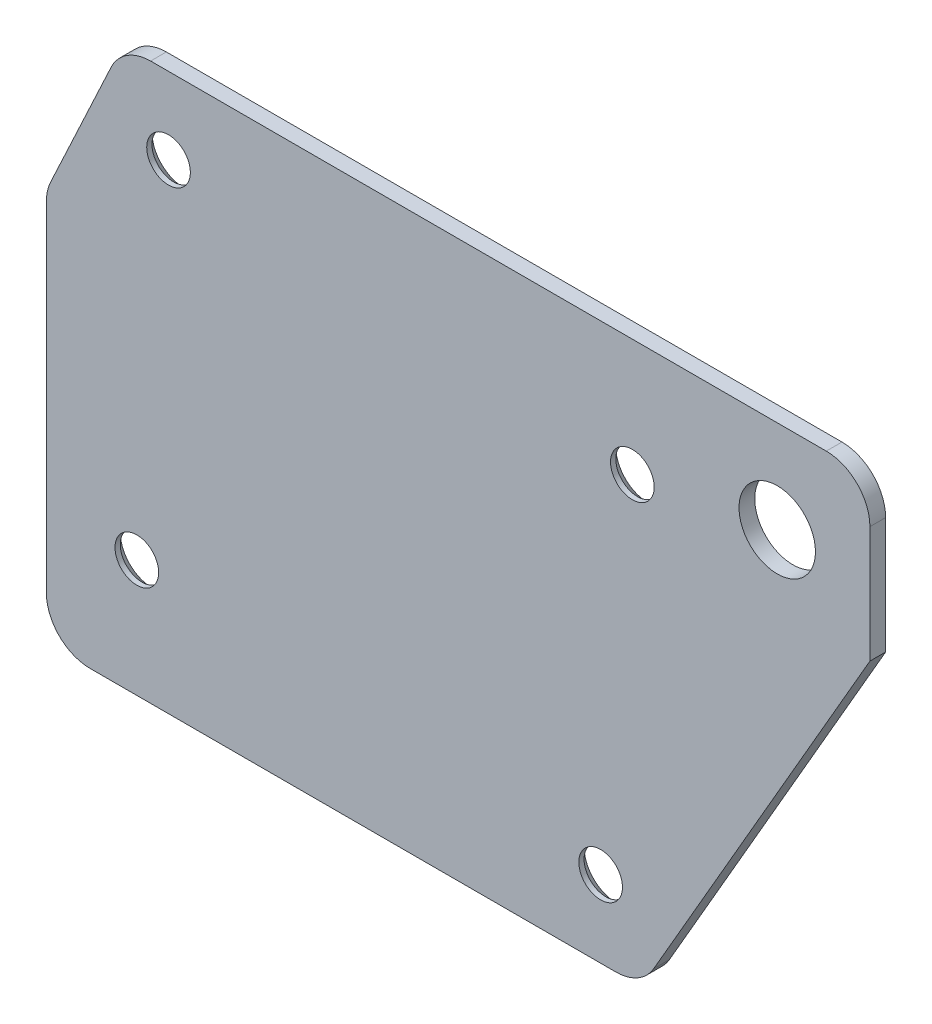
ISO-10303-21;
HEADER;
FILE_DESCRIPTION(('STEP AP214'),'2;1');
FILE_NAME('part.step','',(''),(''),'','','');
FILE_SCHEMA(('AUTOMOTIVE_DESIGN { 1 0 10303 214 1 1 1 1 }'));
ENDSEC;
DATA;
#1=APPLICATION_CONTEXT('core data for automotive mechanical design processes');
#2=APPLICATION_PROTOCOL_DEFINITION('international standard','automotive_design',2000,#1);
#3=PRODUCT_CONTEXT('',#1,'mechanical');
#4=PRODUCT('Part','Part','',(#3));
#5=PRODUCT_RELATED_PRODUCT_CATEGORY('part','',(#4));
#6=PRODUCT_DEFINITION_FORMATION('','',#4);
#7=PRODUCT_DEFINITION_CONTEXT('part definition',#1,'design');
#8=PRODUCT_DEFINITION('design','',#6,#7);
#9=PRODUCT_DEFINITION_SHAPE('','',#8);
#10=(LENGTH_UNIT() NAMED_UNIT(*) SI_UNIT(.MILLI.,.METRE.));
#11=(NAMED_UNIT(*) PLANE_ANGLE_UNIT() SI_UNIT($,.RADIAN.));
#12=(NAMED_UNIT(*) SI_UNIT($,.STERADIAN.) SOLID_ANGLE_UNIT());
#13=UNCERTAINTY_MEASURE_WITH_UNIT(LENGTH_MEASURE(1.E-05),#10,'distance_accuracy_value','');
#14=(GEOMETRIC_REPRESENTATION_CONTEXT(3) GLOBAL_UNCERTAINTY_ASSIGNED_CONTEXT((#13)) GLOBAL_UNIT_ASSIGNED_CONTEXT((#10,
#11,#12)) REPRESENTATION_CONTEXT('',''));
#15=CARTESIAN_POINT('',(0.,0.,0.));
#16=DIRECTION('',(0.,0.,1.));
#17=DIRECTION('',(1.,0.,0.));
#18=AXIS2_PLACEMENT_3D('',#15,#16,#17);
#19=CARTESIAN_POINT('',(37.33799457265,-40.4876,-2.286));
#20=DIRECTION('',(0.866025403784436,-0.500000000000004,0.));
#21=DIRECTION('',(0.500000000000004,0.866025403784436,0.));
#22=AXIS2_PLACEMENT_3D('',#19,#20,#21);
#23=PLANE('',#22);
#24=DIRECTION('',(0.500000000000004,0.866025403784436,0.));
#25=VECTOR('',#24,1.);
#26=CARTESIAN_POINT('',(37.33799457265,-40.4876,0.));
#27=LINE('',#26,#25);
#28=CARTESIAN_POINT('',(39.171081677327,-37.3126,0.));
#29=VERTEX_POINT('',#28);
#30=CARTESIAN_POINT('',(70.6374,17.1886620620045,0.));
#31=VERTEX_POINT('',#30);
#32=EDGE_CURVE('E167',#29,#31,#27,.T.);
#33=ORIENTED_EDGE('',*,*,#32,.F.);
#34=DIRECTION('',(0.,0.,1.));
#35=VECTOR('',#34,1.);
#36=CARTESIAN_POINT('',(39.171081677327,-37.3126,-2.286));
#37=LINE('',#36,#35);
#38=CARTESIAN_POINT('',(39.171081677327,-37.3126,-2.286));
#39=VERTEX_POINT('',#38);
#40=EDGE_CURVE('E55',#29,#39,#37,.F.);
#41=ORIENTED_EDGE('',*,*,#40,.T.);
#42=DIRECTION('',(0.500000000000004,0.866025403784436,0.));
#43=VECTOR('',#42,1.);
#44=CARTESIAN_POINT('',(37.33799457265,-40.4876,-2.286));
#45=LINE('',#44,#43);
#46=CARTESIAN_POINT('',(70.6374,17.1886620620045,-2.286));
#47=VERTEX_POINT('',#46);
#48=EDGE_CURVE('E130',#39,#47,#45,.T.);
#49=ORIENTED_EDGE('',*,*,#48,.T.);
#50=DIRECTION('',(0.,0.,1.));
#51=VECTOR('',#50,1.);
#52=CARTESIAN_POINT('',(70.6374,17.1886620620045,-2.286));
#53=LINE('',#52,#51);
#54=EDGE_CURVE('E132',#47,#31,#53,.T.);
#55=ORIENTED_EDGE('',*,*,#54,.T.);
#56=EDGE_LOOP('',(#33,#41,#49,#55));
#57=FACE_BOUND('',#56,.T.);
#58=ADVANCED_FACE('F47',(#57),#23,.T.);
#59=CARTESIAN_POINT('',(-49.2252,-40.4876,-2.286));
#60=DIRECTION('',(0.,-1.,0.));
#61=DIRECTION('',(0.,0.,-1.));
#62=AXIS2_PLACEMENT_3D('',#59,#60,#61);
#63=PLANE('',#62);
#64=DIRECTION('',(1.,0.,0.));
#65=VECTOR('',#64,1.);
#66=CARTESIAN_POINT('',(-49.2252,-40.4876,-2.286));
#67=LINE('',#66,#65);
#68=CARTESIAN_POINT('',(-42.8752,-40.4876,-2.286));
#69=VERTEX_POINT('',#68);
#70=CARTESIAN_POINT('',(33.6718203632959,-40.4876,-2.286));
#71=VERTEX_POINT('',#70);
#72=EDGE_CURVE('E147',#69,#71,#67,.T.);
#73=ORIENTED_EDGE('',*,*,#72,.T.);
#74=DIRECTION('',(0.,0.,1.));
#75=VECTOR('',#74,1.);
#76=CARTESIAN_POINT('',(33.6718203632959,-40.4876,-2.286));
#77=LINE('',#76,#75);
#78=CARTESIAN_POINT('',(33.6718203632959,-40.4876,0.));
#79=VERTEX_POINT('',#78);
#80=EDGE_CURVE('E325',#71,#79,#77,.T.);
#81=ORIENTED_EDGE('',*,*,#80,.T.);
#82=DIRECTION('',(1.,0.,0.));
#83=VECTOR('',#82,1.);
#84=CARTESIAN_POINT('',(-49.2252,-40.4876,0.));
#85=LINE('',#84,#83);
#86=CARTESIAN_POINT('',(-42.8752,-40.4876,0.));
#87=VERTEX_POINT('',#86);
#88=EDGE_CURVE('E139',#87,#79,#85,.T.);
#89=ORIENTED_EDGE('',*,*,#88,.F.);
#90=DIRECTION('',(0.,0.,1.));
#91=VECTOR('',#90,1.);
#92=CARTESIAN_POINT('',(-42.8752,-40.4876,-2.286));
#93=LINE('',#92,#91);
#94=EDGE_CURVE('E291',#87,#69,#93,.F.);
#95=ORIENTED_EDGE('',*,*,#94,.T.);
#96=EDGE_LOOP('',(#73,#81,#89,#95));
#97=FACE_BOUND('',#96,.T.);
#98=ADVANCED_FACE('F258',(#97),#63,.T.);
#99=CARTESIAN_POINT('',(-49.2252,40.4876,-2.286));
#100=DIRECTION('',(-1.,0.,0.));
#101=DIRECTION('',(0.,-1.,0.));
#102=AXIS2_PLACEMENT_3D('',#99,#100,#101);
#103=PLANE('',#102);
#104=DIRECTION('',(0.,-1.,0.));
#105=VECTOR('',#104,1.);
#106=CARTESIAN_POINT('',(-49.2252,40.4876,0.));
#107=LINE('',#106,#105);
#108=CARTESIAN_POINT('',(-49.2252,15.2217705001645,0.));
#109=VERTEX_POINT('',#108);
#110=CARTESIAN_POINT('',(-49.2252,-34.1376,0.));
#111=VERTEX_POINT('',#110);
#112=EDGE_CURVE('E332',#109,#111,#107,.T.);
#113=ORIENTED_EDGE('',*,*,#112,.F.);
#114=DIRECTION('',(0.,0.,1.));
#115=VECTOR('',#114,1.);
#116=CARTESIAN_POINT('',(-49.2252,15.2217705001645,-2.286));
#117=LINE('',#116,#115);
#118=CARTESIAN_POINT('',(-49.2252,15.2217705001645,-2.286));
#119=VERTEX_POINT('',#118);
#120=EDGE_CURVE('E322',#109,#119,#117,.F.);
#121=ORIENTED_EDGE('',*,*,#120,.T.);
#122=DIRECTION('',(0.,-1.,0.));
#123=VECTOR('',#122,1.);
#124=CARTESIAN_POINT('',(-49.2252,40.4876,-2.286));
#125=LINE('',#124,#123);
#126=CARTESIAN_POINT('',(-49.2252,-34.1376,-2.286));
#127=VERTEX_POINT('',#126);
#128=EDGE_CURVE('E157',#119,#127,#125,.T.);
#129=ORIENTED_EDGE('',*,*,#128,.T.);
#130=DIRECTION('',(0.,0.,1.));
#131=VECTOR('',#130,1.);
#132=CARTESIAN_POINT('',(-49.2252,-34.1376,-2.286));
#133=LINE('',#132,#131);
#134=EDGE_CURVE('E293',#127,#111,#133,.T.);
#135=ORIENTED_EDGE('',*,*,#134,.T.);
#136=EDGE_LOOP('',(#113,#121,#129,#135));
#137=FACE_BOUND('',#136,.T.);
#138=ADVANCED_FACE('F263',(#137),#103,.T.);
#139=CARTESIAN_POINT('',(70.6374,40.4876,-2.286));
#140=DIRECTION('',(0.,1.,0.));
#141=DIRECTION('',(-1.,0.,0.));
#142=AXIS2_PLACEMENT_3D('',#139,#140,#141);
#143=PLANE('',#142);
#144=DIRECTION('',(-1.,0.,0.));
#145=VECTOR('',#144,1.);
#146=CARTESIAN_POINT('',(70.6374,40.4876,-2.286));
#147=LINE('',#146,#145);
#148=CARTESIAN_POINT('',(64.2874,40.4876,-2.286));
#149=VERTEX_POINT('',#148);
#150=CARTESIAN_POINT('',(-34.0546038438724,40.4876,-2.286));
#151=VERTEX_POINT('',#150);
#152=EDGE_CURVE('E154',#149,#151,#147,.T.);
#153=ORIENTED_EDGE('',*,*,#152,.T.);
#154=DIRECTION('',(0.,0.,-1.));
#155=VECTOR('',#154,1.);
#156=CARTESIAN_POINT('',(-34.0546038438724,40.4876,0.));
#157=LINE('',#156,#155);
#158=CARTESIAN_POINT('',(-34.0546038438724,40.4876,0.));
#159=VERTEX_POINT('',#158);
#160=EDGE_CURVE('E311',#151,#159,#157,.F.);
#161=ORIENTED_EDGE('',*,*,#160,.T.);
#162=DIRECTION('',(-1.,0.,0.));
#163=VECTOR('',#162,1.);
#164=CARTESIAN_POINT('',(70.6374,40.4876,0.));
#165=LINE('',#164,#163);
#166=CARTESIAN_POINT('',(64.2874,40.4876,0.));
#167=VERTEX_POINT('',#166);
#168=EDGE_CURVE('E335',#167,#159,#165,.T.);
#169=ORIENTED_EDGE('',*,*,#168,.F.);
#170=DIRECTION('',(0.,0.,1.));
#171=VECTOR('',#170,1.);
#172=CARTESIAN_POINT('',(64.2874,40.4876,-2.286));
#173=LINE('',#172,#171);
#174=EDGE_CURVE('E309',#167,#149,#173,.F.);
#175=ORIENTED_EDGE('',*,*,#174,.T.);
#176=EDGE_LOOP('',(#153,#161,#169,#175));
#177=FACE_BOUND('',#176,.T.);
#178=ADVANCED_FACE('F415',(#177),#143,.T.);
#179=CARTESIAN_POINT('',(70.6374,40.4876,-2.286));
#180=DIRECTION('',(1.,0.,0.));
#181=DIRECTION('',(0.,0.,-1.));
#182=AXIS2_PLACEMENT_3D('',#179,#180,#181);
#183=PLANE('',#182);
#184=DIRECTION('',(0.,1.,0.));
#185=VECTOR('',#184,1.);
#186=CARTESIAN_POINT('',(70.6374,40.4876,-2.286));
#187=LINE('',#186,#185);
#188=CARTESIAN_POINT('',(70.6374,34.1376,-2.286));
#189=VERTEX_POINT('',#188);
#190=EDGE_CURVE('E138',#47,#189,#187,.T.);
#191=ORIENTED_EDGE('',*,*,#190,.T.);
#192=DIRECTION('',(0.,0.,1.));
#193=VECTOR('',#192,1.);
#194=CARTESIAN_POINT('',(70.6374,34.1376,-2.286));
#195=LINE('',#194,#193);
#196=CARTESIAN_POINT('',(70.6374,34.1376,0.));
#197=VERTEX_POINT('',#196);
#198=EDGE_CURVE('E13',#189,#197,#195,.T.);
#199=ORIENTED_EDGE('',*,*,#198,.T.);
#200=DIRECTION('',(0.,1.,0.));
#201=VECTOR('',#200,1.);
#202=CARTESIAN_POINT('',(70.6374,40.4876,0.));
#203=LINE('',#202,#201);
#204=EDGE_CURVE('E145',#31,#197,#203,.T.);
#205=ORIENTED_EDGE('',*,*,#204,.F.);
#206=ORIENTED_EDGE('',*,*,#54,.F.);
#207=EDGE_LOOP('',(#191,#199,#205,#206));
#208=FACE_BOUND('',#207,.T.);
#209=ADVANCED_FACE('F143',(#208),#183,.T.);
#210=CARTESIAN_POINT('',(84.0890480903343,40.4876,-2.286));
#211=DIRECTION('',(0.,0.,1.));
#212=DIRECTION('',(1.,0.,0.));
#213=AXIS2_PLACEMENT_3D('',#210,#211,#212);
#214=PLANE('',#213);
#215=CARTESIAN_POINT('',(36.0628344216532,23.4194785056462,-2.286));
#216=DIRECTION('',(0.,0.,-1.));
#217=DIRECTION('',(-1.,0.,0.));
#218=AXIS2_PLACEMENT_3D('',#215,#216,#217);
#219=CIRCLE('',#218,4.699);
#220=CARTESIAN_POINT('',(31.3638344216532,23.4194785056462,-2.286));
#221=VERTEX_POINT('',#220);
#222=EDGE_CURVE('E353',#221,#221,#219,.T.);
#223=ORIENTED_EDGE('',*,*,#222,.F.);
#224=EDGE_LOOP('',(#223));
#225=FACE_BOUND('',#224,.T.);
#226=CARTESIAN_POINT('',(-31.4482091696243,29.3259294826875,-2.286));
#227=DIRECTION('',(0.,0.,-1.));
#228=DIRECTION('',(-1.,0.,0.));
#229=AXIS2_PLACEMENT_3D('',#226,#227,#228);
#230=CIRCLE('',#229,4.699);
#231=CARTESIAN_POINT('',(-36.1472091696243,29.3259294826875,-2.286));
#232=VERTEX_POINT('',#231);
#233=EDGE_CURVE('E214',#232,#232,#230,.T.);
#234=ORIENTED_EDGE('',*,*,#233,.F.);
#235=EDGE_LOOP('',(#234));
#236=FACE_BOUND('',#235,.T.);
#237=CARTESIAN_POINT('',(-36.0628344216532,-23.4194785056462,-2.286));
#238=DIRECTION('',(0.,0.,-1.));
#239=DIRECTION('',(-1.,0.,0.));
#240=AXIS2_PLACEMENT_3D('',#237,#238,#239);
#241=CIRCLE('',#240,4.699);
#242=CARTESIAN_POINT('',(-40.7618344216532,-23.4194785056462,-2.286));
#243=VERTEX_POINT('',#242);
#244=EDGE_CURVE('E228',#243,#243,#241,.T.);
#245=ORIENTED_EDGE('',*,*,#244,.F.);
#246=EDGE_LOOP('',(#245));
#247=FACE_BOUND('',#246,.T.);
#248=CARTESIAN_POINT('',(31.4482091696243,-29.3259294826875,-2.286));
#249=DIRECTION('',(0.,0.,-1.));
#250=DIRECTION('',(-1.,0.,0.));
#251=AXIS2_PLACEMENT_3D('',#248,#249,#250);
#252=CIRCLE('',#251,4.699);
#253=CARTESIAN_POINT('',(26.7492091696243,-29.3259294826875,-2.286));
#254=VERTEX_POINT('',#253);
#255=EDGE_CURVE('E200',#254,#254,#252,.T.);
#256=ORIENTED_EDGE('',*,*,#255,.F.);
#257=EDGE_LOOP('',(#256));
#258=FACE_BOUND('',#257,.T.);
#259=CARTESIAN_POINT('',(57.15,27.0002,-2.286));
#260=DIRECTION('',(0.,0.,1.));
#261=DIRECTION('',(1.,0.,0.));
#262=AXIS2_PLACEMENT_3D('',#259,#260,#261);
#263=CIRCLE('',#262,5.56260000000002);
#264=CARTESIAN_POINT('',(62.7126,27.0002,-2.286));
#265=VERTEX_POINT('',#264);
#266=EDGE_CURVE('E176',#265,#265,#263,.T.);
#267=ORIENTED_EDGE('',*,*,#266,.T.);
#268=EDGE_LOOP('',(#267));
#269=FACE_BOUND('',#268,.T.);
#270=DIRECTION('',(0.4226182617407,0.90630778703665,0.));
#271=VECTOR('',#270,1.);
#272=CARTESIAN_POINT('',(-34.5467356448589,48.1076,-2.286));
#273=LINE('',#272,#271);
#274=CARTESIAN_POINT('',(-48.6302544476827,17.9053964622179,-2.286));
#275=VERTEX_POINT('',#274);
#276=CARTESIAN_POINT('',(-39.8096582915552,36.8212259620534,-2.286));
#277=VERTEX_POINT('',#276);
#278=EDGE_CURVE('E347',#275,#277,#273,.T.);
#279=ORIENTED_EDGE('',*,*,#278,.T.);
#280=CARTESIAN_POINT('',(-34.0546038438724,34.1376,-2.286));
#281=DIRECTION('',(0.,0.,1.));
#282=DIRECTION('',(1.,0.,0.));
#283=AXIS2_PLACEMENT_3D('',#280,#281,#282);
#284=CIRCLE('',#283,6.35);
#285=EDGE_CURVE('E306',#277,#151,#284,.F.);
#286=ORIENTED_EDGE('',*,*,#285,.T.);
#287=ORIENTED_EDGE('',*,*,#152,.F.);
#288=CARTESIAN_POINT('',(64.2874,34.1376,-2.286));
#289=DIRECTION('',(0.,0.,1.));
#290=DIRECTION('',(1.,0.,0.));
#291=AXIS2_PLACEMENT_3D('',#288,#289,#290);
#292=CIRCLE('',#291,6.35);
#293=EDGE_CURVE('E153',#149,#189,#292,.F.);
#294=ORIENTED_EDGE('',*,*,#293,.T.);
#295=ORIENTED_EDGE('',*,*,#190,.F.);
#296=ORIENTED_EDGE('',*,*,#48,.F.);
#297=CARTESIAN_POINT('',(33.6718203632959,-34.1376,-2.286));
#298=DIRECTION('',(0.,0.,1.));
#299=DIRECTION('',(1.,0.,0.));
#300=AXIS2_PLACEMENT_3D('',#297,#298,#299);
#301=CIRCLE('',#300,6.35);
#302=EDGE_CURVE('E296',#39,#71,#301,.F.);
#303=ORIENTED_EDGE('',*,*,#302,.T.);
#304=ORIENTED_EDGE('',*,*,#72,.F.);
#305=CARTESIAN_POINT('',(-42.8752,-34.1376,-2.286));
#306=DIRECTION('',(0.,0.,1.));
#307=DIRECTION('',(1.,0.,0.));
#308=AXIS2_PLACEMENT_3D('',#305,#306,#307);
#309=CIRCLE('',#308,6.35);
#310=EDGE_CURVE('E290',#69,#127,#309,.F.);
#311=ORIENTED_EDGE('',*,*,#310,.T.);
#312=ORIENTED_EDGE('',*,*,#128,.F.);
#313=CARTESIAN_POINT('',(-42.8752,15.2217705001645,-2.286));
#314=DIRECTION('',(0.,0.,1.));
#315=DIRECTION('',(1.,0.,0.));
#316=AXIS2_PLACEMENT_3D('',#313,#314,#315);
#317=CIRCLE('',#316,6.35);
#318=EDGE_CURVE('E298',#119,#275,#317,.F.);
#319=ORIENTED_EDGE('',*,*,#318,.T.);
#320=EDGE_LOOP('',(#279,#286,#287,#294,#295,#296,#303,#304,#311,#312,#319));
#321=FACE_BOUND('',#320,.T.);
#322=ADVANCED_FACE('F150',(#225,#236,#247,#258,#269,#321),#214,.F.);
#323=CARTESIAN_POINT('',(84.0890480903343,40.4876,0.));
#324=DIRECTION('',(0.,0.,1.));
#325=DIRECTION('',(1.,0.,0.));
#326=AXIS2_PLACEMENT_3D('',#323,#324,#325);
#327=PLANE('',#326);
#328=ORIENTED_EDGE('',*,*,#168,.T.);
#329=CARTESIAN_POINT('',(-34.0546038438724,34.1376,0.));
#330=DIRECTION('',(0.,0.,1.));
#331=DIRECTION('',(1.,0.,0.));
#332=AXIS2_PLACEMENT_3D('',#329,#330,#331);
#333=CIRCLE('',#332,6.35);
#334=CARTESIAN_POINT('',(-39.8096582915552,36.8212259620534,0.));
#335=VERTEX_POINT('',#334);
#336=EDGE_CURVE('E319',#159,#335,#333,.T.);
#337=ORIENTED_EDGE('',*,*,#336,.T.);
#338=DIRECTION('',(0.4226182617407,0.906307787036649,0.));
#339=VECTOR('',#338,1.);
#340=CARTESIAN_POINT('',(-16.2762790307625,87.2887206497991,0.));
#341=LINE('',#340,#339);
#342=CARTESIAN_POINT('',(-48.6302544476827,17.9053964622179,0.));
#343=VERTEX_POINT('',#342);
#344=EDGE_CURVE('E146',#343,#335,#341,.T.);
#345=ORIENTED_EDGE('',*,*,#344,.F.);
#346=CARTESIAN_POINT('',(-42.8752,15.2217705001645,0.));
#347=DIRECTION('',(0.,0.,1.));
#348=DIRECTION('',(1.,0.,0.));
#349=AXIS2_PLACEMENT_3D('',#346,#347,#348);
#350=CIRCLE('',#349,6.35);
#351=EDGE_CURVE('E317',#343,#109,#350,.T.);
#352=ORIENTED_EDGE('',*,*,#351,.T.);
#353=ORIENTED_EDGE('',*,*,#112,.T.);
#354=CARTESIAN_POINT('',(-42.8752,-34.1376,0.));
#355=DIRECTION('',(0.,0.,1.));
#356=DIRECTION('',(1.,0.,0.));
#357=AXIS2_PLACEMENT_3D('',#354,#355,#356);
#358=CIRCLE('',#357,6.35);
#359=EDGE_CURVE('E314',#111,#87,#358,.T.);
#360=ORIENTED_EDGE('',*,*,#359,.T.);
#361=ORIENTED_EDGE('',*,*,#88,.T.);
#362=CARTESIAN_POINT('',(33.6718203632959,-34.1376,0.));
#363=DIRECTION('',(0.,0.,1.));
#364=DIRECTION('',(1.,0.,0.));
#365=AXIS2_PLACEMENT_3D('',#362,#363,#364);
#366=CIRCLE('',#365,6.35);
#367=EDGE_CURVE('E69',#79,#29,#366,.T.);
#368=ORIENTED_EDGE('',*,*,#367,.T.);
#369=ORIENTED_EDGE('',*,*,#32,.T.);
#370=ORIENTED_EDGE('',*,*,#204,.T.);
#371=CARTESIAN_POINT('',(64.2874,34.1376,0.));
#372=DIRECTION('',(0.,0.,1.));
#373=DIRECTION('',(1.,0.,0.));
#374=AXIS2_PLACEMENT_3D('',#371,#372,#373);
#375=CIRCLE('',#374,6.35);
#376=EDGE_CURVE('E62',#197,#167,#375,.T.);
#377=ORIENTED_EDGE('',*,*,#376,.T.);
#378=EDGE_LOOP('',(#328,#337,#345,#352,#353,#360,#361,#368,#369,#370,#377));
#379=FACE_BOUND('',#378,.T.);
#380=CARTESIAN_POINT('',(36.0628344216532,23.4194785056462,0.));
#381=DIRECTION('',(0.,0.,-1.));
#382=DIRECTION('',(-1.,0.,0.));
#383=AXIS2_PLACEMENT_3D('',#380,#381,#382);
#384=CIRCLE('',#383,3.175);
#385=CARTESIAN_POINT('',(32.8878344216532,23.4194785056462,0.));
#386=VERTEX_POINT('',#385);
#387=EDGE_CURVE('E221',#386,#386,#384,.T.);
#388=ORIENTED_EDGE('',*,*,#387,.T.);
#389=EDGE_LOOP('',(#388));
#390=FACE_BOUND('',#389,.T.);
#391=CARTESIAN_POINT('',(-31.4482091696243,29.3259294826875,0.));
#392=DIRECTION('',(0.,0.,-1.));
#393=DIRECTION('',(-1.,0.,0.));
#394=AXIS2_PLACEMENT_3D('',#391,#392,#393);
#395=CIRCLE('',#394,3.175);
#396=CARTESIAN_POINT('',(-34.6232091696243,29.3259294826875,0.));
#397=VERTEX_POINT('',#396);
#398=EDGE_CURVE('E225',#397,#397,#395,.T.);
#399=ORIENTED_EDGE('',*,*,#398,.T.);
#400=EDGE_LOOP('',(#399));
#401=FACE_BOUND('',#400,.T.);
#402=CARTESIAN_POINT('',(-36.0628344216532,-23.4194785056462,0.));
#403=DIRECTION('',(0.,0.,-1.));
#404=DIRECTION('',(-1.,0.,0.));
#405=AXIS2_PLACEMENT_3D('',#402,#403,#404);
#406=CIRCLE('',#405,3.175);
#407=CARTESIAN_POINT('',(-39.2378344216532,-23.4194785056462,0.));
#408=VERTEX_POINT('',#407);
#409=EDGE_CURVE('E205',#408,#408,#406,.T.);
#410=ORIENTED_EDGE('',*,*,#409,.T.);
#411=EDGE_LOOP('',(#410));
#412=FACE_BOUND('',#411,.T.);
#413=CARTESIAN_POINT('',(31.4482091696243,-29.3259294826875,0.));
#414=DIRECTION('',(0.,0.,-1.));
#415=DIRECTION('',(-1.,0.,0.));
#416=AXIS2_PLACEMENT_3D('',#413,#414,#415);
#417=CIRCLE('',#416,3.175);
#418=CARTESIAN_POINT('',(28.2732091696243,-29.3259294826875,0.));
#419=VERTEX_POINT('',#418);
#420=EDGE_CURVE('E182',#419,#419,#417,.T.);
#421=ORIENTED_EDGE('',*,*,#420,.T.);
#422=EDGE_LOOP('',(#421));
#423=FACE_BOUND('',#422,.T.);
#424=CARTESIAN_POINT('',(57.15,27.0002,0.));
#425=DIRECTION('',(0.,0.,1.));
#426=DIRECTION('',(1.,0.,0.));
#427=AXIS2_PLACEMENT_3D('',#424,#425,#426);
#428=CIRCLE('',#427,5.56260000000002);
#429=CARTESIAN_POINT('',(62.7126,27.0002,0.));
#430=VERTEX_POINT('',#429);
#431=EDGE_CURVE('E181',#430,#430,#428,.T.);
#432=ORIENTED_EDGE('',*,*,#431,.F.);
#433=EDGE_LOOP('',(#432));
#434=FACE_BOUND('',#433,.T.);
#435=ADVANCED_FACE('F240',(#379,#390,#401,#412,#423,#434),#327,.T.);
#436=CARTESIAN_POINT('',(57.15,27.0002,-2.286));
#437=DIRECTION('',(0.,0.,1.));
#438=DIRECTION('',(1.,0.,0.));
#439=AXIS2_PLACEMENT_3D('',#436,#437,#438);
#440=CYLINDRICAL_SURFACE('',#439,5.56260000000002);
#441=ORIENTED_EDGE('',*,*,#266,.F.);
#442=EDGE_LOOP('',(#441));
#443=FACE_BOUND('',#442,.T.);
#444=ORIENTED_EDGE('',*,*,#431,.T.);
#445=EDGE_LOOP('',(#444));
#446=FACE_BOUND('',#445,.T.);
#447=ADVANCED_FACE('F403',(#443,#446),#440,.F.);
#448=CARTESIAN_POINT('',(31.4482091696243,-29.3259294826875,-2.286));
#449=DIRECTION('',(0.,0.,-1.));
#450=DIRECTION('',(-1.,0.,0.));
#451=AXIS2_PLACEMENT_3D('',#448,#449,#450);
#452=CYLINDRICAL_SURFACE('',#451,3.175);
#453=ORIENTED_EDGE('',*,*,#420,.F.);
#454=EDGE_LOOP('',(#453));
#455=FACE_BOUND('',#454,.T.);
#456=CARTESIAN_POINT('',(31.4482091696243,-29.3259294826875,-0.762000000000001));
#457=DIRECTION('',(0.,0.,-1.));
#458=DIRECTION('',(-1.,0.,0.));
#459=AXIS2_PLACEMENT_3D('',#456,#457,#458);
#460=CIRCLE('',#459,3.175);
#461=CARTESIAN_POINT('',(28.2732091696243,-29.3259294826875,-0.762000000000001));
#462=VERTEX_POINT('',#461);
#463=EDGE_CURVE('E193',#462,#462,#460,.T.);
#464=ORIENTED_EDGE('',*,*,#463,.T.);
#465=EDGE_LOOP('',(#464));
#466=FACE_BOUND('',#465,.T.);
#467=ADVANCED_FACE('F254',(#455,#466),#452,.F.);
#468=CARTESIAN_POINT('',(31.4482091696243,-29.3259294826875,-2.286));
#469=DIRECTION('',(0.,0.,-1.));
#470=DIRECTION('',(-1.,0.,0.));
#471=AXIS2_PLACEMENT_3D('',#468,#469,#470);
#472=CONICAL_SURFACE('',#471,4.699,0.78539816339745);
#473=ORIENTED_EDGE('',*,*,#463,.F.);
#474=EDGE_LOOP('',(#473));
#475=FACE_BOUND('',#474,.T.);
#476=ORIENTED_EDGE('',*,*,#255,.T.);
#477=EDGE_LOOP('',(#476));
#478=FACE_BOUND('',#477,.T.);
#479=ADVANCED_FACE('F245',(#475,#478),#472,.F.);
#480=CARTESIAN_POINT('',(-36.0628344216532,-23.4194785056462,-2.286));
#481=DIRECTION('',(0.,0.,-1.));
#482=DIRECTION('',(-1.,0.,0.));
#483=AXIS2_PLACEMENT_3D('',#480,#481,#482);
#484=CYLINDRICAL_SURFACE('',#483,3.175);
#485=ORIENTED_EDGE('',*,*,#409,.F.);
#486=EDGE_LOOP('',(#485));
#487=FACE_BOUND('',#486,.T.);
#488=CARTESIAN_POINT('',(-36.0628344216532,-23.4194785056462,-0.762000000000001));
#489=DIRECTION('',(0.,0.,-1.));
#490=DIRECTION('',(-1.,0.,0.));
#491=AXIS2_PLACEMENT_3D('',#488,#489,#490);
#492=CIRCLE('',#491,3.175);
#493=CARTESIAN_POINT('',(-39.2378344216532,-23.4194785056462,-0.762000000000001));
#494=VERTEX_POINT('',#493);
#495=EDGE_CURVE('E232',#494,#494,#492,.T.);
#496=ORIENTED_EDGE('',*,*,#495,.T.);
#497=EDGE_LOOP('',(#496));
#498=FACE_BOUND('',#497,.T.);
#499=ADVANCED_FACE('F242',(#487,#498),#484,.F.);
#500=CARTESIAN_POINT('',(-36.0628344216532,-23.4194785056462,-2.286));
#501=DIRECTION('',(0.,0.,-1.));
#502=DIRECTION('',(-1.,0.,0.));
#503=AXIS2_PLACEMENT_3D('',#500,#501,#502);
#504=CONICAL_SURFACE('',#503,4.699,0.78539816339745);
#505=ORIENTED_EDGE('',*,*,#495,.F.);
#506=EDGE_LOOP('',(#505));
#507=FACE_BOUND('',#506,.T.);
#508=ORIENTED_EDGE('',*,*,#244,.T.);
#509=EDGE_LOOP('',(#508));
#510=FACE_BOUND('',#509,.T.);
#511=ADVANCED_FACE('F244',(#507,#510),#504,.F.);
#512=CARTESIAN_POINT('',(-31.4482091696243,29.3259294826875,-2.286));
#513=DIRECTION('',(0.,0.,-1.));
#514=DIRECTION('',(-1.,0.,0.));
#515=AXIS2_PLACEMENT_3D('',#512,#513,#514);
#516=CYLINDRICAL_SURFACE('',#515,3.175);
#517=ORIENTED_EDGE('',*,*,#398,.F.);
#518=EDGE_LOOP('',(#517));
#519=FACE_BOUND('',#518,.T.);
#520=CARTESIAN_POINT('',(-31.4482091696243,29.3259294826875,-0.762000000000001));
#521=DIRECTION('',(0.,0.,-1.));
#522=DIRECTION('',(-1.,0.,0.));
#523=AXIS2_PLACEMENT_3D('',#520,#521,#522);
#524=CIRCLE('',#523,3.175);
#525=CARTESIAN_POINT('',(-34.6232091696243,29.3259294826875,-0.762000000000001));
#526=VERTEX_POINT('',#525);
#527=EDGE_CURVE('E220',#526,#526,#524,.T.);
#528=ORIENTED_EDGE('',*,*,#527,.T.);
#529=EDGE_LOOP('',(#528));
#530=FACE_BOUND('',#529,.T.);
#531=ADVANCED_FACE('F251',(#519,#530),#516,.F.);
#532=CARTESIAN_POINT('',(-31.4482091696243,29.3259294826875,-2.286));
#533=DIRECTION('',(0.,0.,-1.));
#534=DIRECTION('',(-1.,0.,0.));
#535=AXIS2_PLACEMENT_3D('',#532,#533,#534);
#536=CONICAL_SURFACE('',#535,4.699,0.785398163397449);
#537=ORIENTED_EDGE('',*,*,#527,.F.);
#538=EDGE_LOOP('',(#537));
#539=FACE_BOUND('',#538,.T.);
#540=ORIENTED_EDGE('',*,*,#233,.T.);
#541=EDGE_LOOP('',(#540));
#542=FACE_BOUND('',#541,.T.);
#543=ADVANCED_FACE('F371',(#539,#542),#536,.F.);
#544=CARTESIAN_POINT('',(36.0628344216532,23.4194785056462,-2.286));
#545=DIRECTION('',(0.,0.,-1.));
#546=DIRECTION('',(-1.,0.,0.));
#547=AXIS2_PLACEMENT_3D('',#544,#545,#546);
#548=CYLINDRICAL_SURFACE('',#547,3.175);
#549=ORIENTED_EDGE('',*,*,#387,.F.);
#550=EDGE_LOOP('',(#549));
#551=FACE_BOUND('',#550,.T.);
#552=CARTESIAN_POINT('',(36.0628344216532,23.4194785056462,-0.762000000000001));
#553=DIRECTION('',(0.,0.,-1.));
#554=DIRECTION('',(-1.,0.,0.));
#555=AXIS2_PLACEMENT_3D('',#552,#553,#554);
#556=CIRCLE('',#555,3.175);
#557=CARTESIAN_POINT('',(32.8878344216532,23.4194785056462,-0.762000000000001));
#558=VERTEX_POINT('',#557);
#559=EDGE_CURVE('E357',#558,#558,#556,.T.);
#560=ORIENTED_EDGE('',*,*,#559,.T.);
#561=EDGE_LOOP('',(#560));
#562=FACE_BOUND('',#561,.T.);
#563=ADVANCED_FACE('F368',(#551,#562),#548,.F.);
#564=CARTESIAN_POINT('',(36.0628344216532,23.4194785056462,-2.286));
#565=DIRECTION('',(0.,0.,-1.));
#566=DIRECTION('',(-1.,0.,0.));
#567=AXIS2_PLACEMENT_3D('',#564,#565,#566);
#568=CONICAL_SURFACE('',#567,4.699,0.78539816339745);
#569=ORIENTED_EDGE('',*,*,#559,.F.);
#570=EDGE_LOOP('',(#569));
#571=FACE_BOUND('',#570,.T.);
#572=ORIENTED_EDGE('',*,*,#222,.T.);
#573=EDGE_LOOP('',(#572));
#574=FACE_BOUND('',#573,.T.);
#575=ADVANCED_FACE('F370',(#571,#574),#568,.F.);
#576=CARTESIAN_POINT('',(-34.5467356448589,48.1076,-2.286));
#577=DIRECTION('',(0.906307787036649,-0.4226182617407,0.));
#578=DIRECTION('',(0.4226182617407,0.906307787036649,0.));
#579=AXIS2_PLACEMENT_3D('',#576,#577,#578);
#580=PLANE('',#579);
#581=ORIENTED_EDGE('',*,*,#344,.T.);
#582=DIRECTION('',(0.,0.,-1.));
#583=VECTOR('',#582,1.);
#584=CARTESIAN_POINT('',(-39.8096582915552,36.8212259620534,-2.286));
#585=LINE('',#584,#583);
#586=EDGE_CURVE('E300',#335,#277,#585,.T.);
#587=ORIENTED_EDGE('',*,*,#586,.T.);
#588=ORIENTED_EDGE('',*,*,#278,.F.);
#589=DIRECTION('',(0.,0.,1.));
#590=VECTOR('',#589,1.);
#591=CARTESIAN_POINT('',(-48.6302544476827,17.9053964622179,0.));
#592=LINE('',#591,#590);
#593=EDGE_CURVE('E341',#275,#343,#592,.T.);
#594=ORIENTED_EDGE('',*,*,#593,.T.);
#595=EDGE_LOOP('',(#581,#587,#588,#594));
#596=FACE_BOUND('',#595,.T.);
#597=ADVANCED_FACE('F273',(#596),#580,.F.);
#598=CARTESIAN_POINT('',(-34.0546038438724,34.1376,-2.286));
#599=DIRECTION('',(0.,0.,1.));
#600=DIRECTION('',(1.,0.,0.));
#601=AXIS2_PLACEMENT_3D('',#598,#599,#600);
#602=CYLINDRICAL_SURFACE('',#601,6.35);
#603=ORIENTED_EDGE('',*,*,#336,.F.);
#604=ORIENTED_EDGE('',*,*,#160,.F.);
#605=ORIENTED_EDGE('',*,*,#285,.F.);
#606=ORIENTED_EDGE('',*,*,#586,.F.);
#607=EDGE_LOOP('',(#603,#604,#605,#606));
#608=FACE_BOUND('',#607,.T.);
#609=ADVANCED_FACE('F269',(#608),#602,.T.);
#610=CARTESIAN_POINT('',(-42.8752,15.2217705001645,-2.286));
#611=DIRECTION('',(0.,0.,-1.));
#612=DIRECTION('',(-1.,0.,0.));
#613=AXIS2_PLACEMENT_3D('',#610,#611,#612);
#614=CYLINDRICAL_SURFACE('',#613,6.35);
#615=ORIENTED_EDGE('',*,*,#318,.F.);
#616=ORIENTED_EDGE('',*,*,#120,.F.);
#617=ORIENTED_EDGE('',*,*,#351,.F.);
#618=ORIENTED_EDGE('',*,*,#593,.F.);
#619=EDGE_LOOP('',(#615,#616,#617,#618));
#620=FACE_BOUND('',#619,.T.);
#621=ADVANCED_FACE('F272',(#620),#614,.T.);
#622=CARTESIAN_POINT('',(33.6718203632959,-34.1376,-2.286));
#623=DIRECTION('',(0.,0.,1.));
#624=DIRECTION('',(1.,0.,0.));
#625=AXIS2_PLACEMENT_3D('',#622,#623,#624);
#626=CYLINDRICAL_SURFACE('',#625,6.35);
#627=ORIENTED_EDGE('',*,*,#302,.F.);
#628=ORIENTED_EDGE('',*,*,#40,.F.);
#629=ORIENTED_EDGE('',*,*,#367,.F.);
#630=ORIENTED_EDGE('',*,*,#80,.F.);
#631=EDGE_LOOP('',(#627,#628,#629,#630));
#632=FACE_BOUND('',#631,.T.);
#633=ADVANCED_FACE('F277',(#632),#626,.T.);
#634=CARTESIAN_POINT('',(-42.8752,-34.1376,-2.286));
#635=DIRECTION('',(0.,0.,1.));
#636=DIRECTION('',(1.,0.,0.));
#637=AXIS2_PLACEMENT_3D('',#634,#635,#636);
#638=CYLINDRICAL_SURFACE('',#637,6.35);
#639=ORIENTED_EDGE('',*,*,#310,.F.);
#640=ORIENTED_EDGE('',*,*,#94,.F.);
#641=ORIENTED_EDGE('',*,*,#359,.F.);
#642=ORIENTED_EDGE('',*,*,#134,.F.);
#643=EDGE_LOOP('',(#639,#640,#641,#642));
#644=FACE_BOUND('',#643,.T.);
#645=ADVANCED_FACE('F280',(#644),#638,.T.);
#646=CARTESIAN_POINT('',(64.2874,34.1376,-2.286));
#647=DIRECTION('',(0.,0.,1.));
#648=DIRECTION('',(1.,0.,0.));
#649=AXIS2_PLACEMENT_3D('',#646,#647,#648);
#650=CYLINDRICAL_SURFACE('',#649,6.35);
#651=ORIENTED_EDGE('',*,*,#293,.F.);
#652=ORIENTED_EDGE('',*,*,#174,.F.);
#653=ORIENTED_EDGE('',*,*,#376,.F.);
#654=ORIENTED_EDGE('',*,*,#198,.F.);
#655=EDGE_LOOP('',(#651,#652,#653,#654));
#656=FACE_BOUND('',#655,.T.);
#657=ADVANCED_FACE('F49',(#656),#650,.T.);
#658=CLOSED_SHELL('',(#58,#98,#138,#178,#209,#322,#435,#447,#467,#479,#499,#511,#531,#543,#563,
#575,#597,#609,#621,#633,#645,#657));
#659=MANIFOLD_SOLID_BREP('B2',#658);
#660=ADVANCED_BREP_SHAPE_REPRESENTATION('',(#18,#659),#14);
#661=SHAPE_DEFINITION_REPRESENTATION(#9,#660);
ENDSEC;
END-ISO-10303-21;
